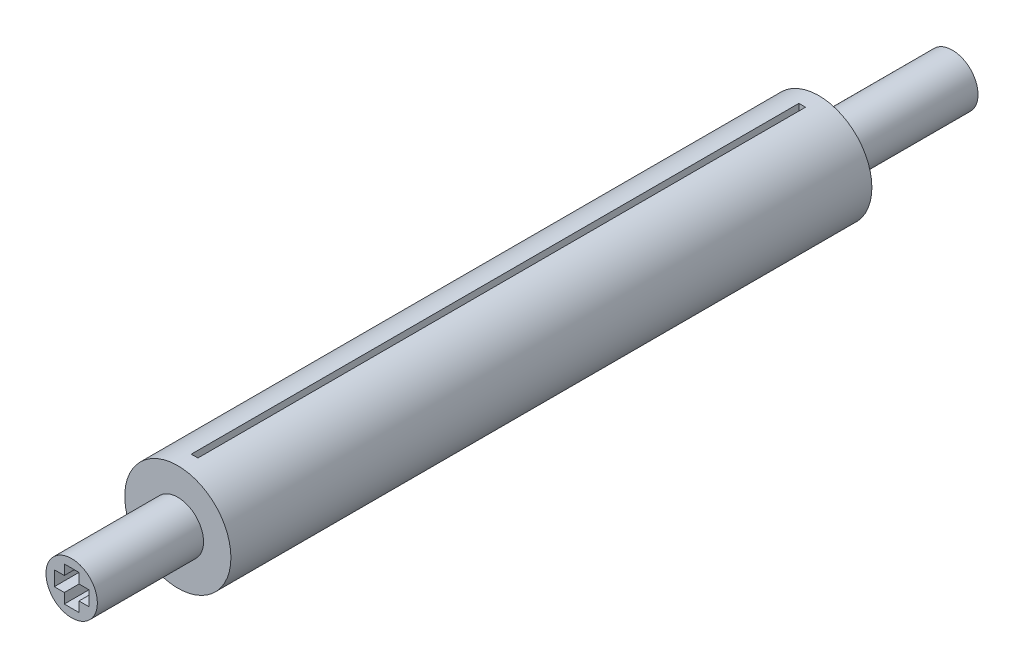
ISO-10303-21;
HEADER;
FILE_DESCRIPTION(('STEP AP214'),'2;1');
FILE_NAME('part.step','',(''),(''),'','','');
FILE_SCHEMA(('AUTOMOTIVE_DESIGN { 1 0 10303 214 1 1 1 1 }'));
ENDSEC;
DATA;
#1=APPLICATION_CONTEXT('core data for automotive mechanical design processes');
#2=APPLICATION_PROTOCOL_DEFINITION('international standard','automotive_design',2000,#1);
#3=PRODUCT_CONTEXT('',#1,'mechanical');
#4=PRODUCT('Part','Part','',(#3));
#5=PRODUCT_RELATED_PRODUCT_CATEGORY('part','',(#4));
#6=PRODUCT_DEFINITION_FORMATION('','',#4);
#7=PRODUCT_DEFINITION_CONTEXT('part definition',#1,'design');
#8=PRODUCT_DEFINITION('design','',#6,#7);
#9=PRODUCT_DEFINITION_SHAPE('','',#8);
#10=(LENGTH_UNIT() NAMED_UNIT(*) SI_UNIT(.MILLI.,.METRE.));
#11=(NAMED_UNIT(*) PLANE_ANGLE_UNIT() SI_UNIT($,.RADIAN.));
#12=(NAMED_UNIT(*) SI_UNIT($,.STERADIAN.) SOLID_ANGLE_UNIT());
#13=UNCERTAINTY_MEASURE_WITH_UNIT(LENGTH_MEASURE(1.E-05),#10,'distance_accuracy_value','');
#14=(GEOMETRIC_REPRESENTATION_CONTEXT(3) GLOBAL_UNCERTAINTY_ASSIGNED_CONTEXT((#13)) GLOBAL_UNIT_ASSIGNED_CONTEXT((#10,
#11,#12)) REPRESENTATION_CONTEXT('',''));
#15=CARTESIAN_POINT('',(0.,0.,0.));
#16=DIRECTION('',(0.,0.,1.));
#17=DIRECTION('',(1.,0.,0.));
#18=AXIS2_PLACEMENT_3D('',#15,#16,#17);
#19=CARTESIAN_POINT('',(0.,0.,48.));
#20=DIRECTION('',(0.,0.,-1.));
#21=DIRECTION('',(-1.,0.,0.));
#22=AXIS2_PLACEMENT_3D('',#19,#20,#21);
#23=CYLINDRICAL_SURFACE('',#22,7.95);
#24=DIRECTION('',(0.,0.,-1.));
#25=VECTOR('',#24,1.);
#26=CARTESIAN_POINT('',(0.5,7.93426115022691,48.));
#27=LINE('',#26,#25);
#28=CARTESIAN_POINT('',(0.5,7.93426115022691,-45.5));
#29=VERTEX_POINT('',#28);
#30=CARTESIAN_POINT('',(0.5,7.93426115022691,45.5));
#31=VERTEX_POINT('',#30);
#32=EDGE_CURVE('E11',#29,#31,#27,.F.);
#33=ORIENTED_EDGE('',*,*,#32,.T.);
#34=CARTESIAN_POINT('',(0.,0.,45.5));
#35=DIRECTION('',(0.,0.,1.));
#36=DIRECTION('',(1.,0.,0.));
#37=AXIS2_PLACEMENT_3D('',#34,#35,#36);
#38=CIRCLE('',#37,7.95);
#39=CARTESIAN_POINT('',(-0.5,7.93426115022691,45.5));
#40=VERTEX_POINT('',#39);
#41=EDGE_CURVE('E279',#31,#40,#38,.T.);
#42=ORIENTED_EDGE('',*,*,#41,.T.);
#43=DIRECTION('',(0.,0.,-1.));
#44=VECTOR('',#43,1.);
#45=CARTESIAN_POINT('',(-0.5,7.93426115022691,48.));
#46=LINE('',#45,#44);
#47=CARTESIAN_POINT('',(-0.5,7.93426115022691,-45.5));
#48=VERTEX_POINT('',#47);
#49=EDGE_CURVE('E43',#40,#48,#46,.T.);
#50=ORIENTED_EDGE('',*,*,#49,.T.);
#51=CARTESIAN_POINT('',(0.,0.,-45.5));
#52=DIRECTION('',(0.,0.,-1.));
#53=DIRECTION('',(-1.,0.,0.));
#54=AXIS2_PLACEMENT_3D('',#51,#52,#53);
#55=CIRCLE('',#54,7.95);
#56=EDGE_CURVE('E292',#48,#29,#55,.T.);
#57=ORIENTED_EDGE('',*,*,#56,.T.);
#58=EDGE_LOOP('',(#33,#42,#50,#57));
#59=FACE_BOUND('',#58,.T.);
#60=CARTESIAN_POINT('',(0.,0.,48.));
#61=DIRECTION('',(0.,0.,1.));
#62=DIRECTION('',(1.,0.,0.));
#63=AXIS2_PLACEMENT_3D('',#60,#61,#62);
#64=CIRCLE('',#63,7.95);
#65=CARTESIAN_POINT('',(7.95,0.,48.));
#66=VERTEX_POINT('',#65);
#67=EDGE_CURVE('E286',#66,#66,#64,.T.);
#68=ORIENTED_EDGE('',*,*,#67,.F.);
#69=EDGE_LOOP('',(#68));
#70=FACE_BOUND('',#69,.T.);
#71=CARTESIAN_POINT('',(0.,0.,-48.));
#72=DIRECTION('',(0.,0.,1.));
#73=DIRECTION('',(1.,0.,0.));
#74=AXIS2_PLACEMENT_3D('',#71,#72,#73);
#75=CIRCLE('',#74,7.95);
#76=CARTESIAN_POINT('',(7.95,0.,-48.));
#77=VERTEX_POINT('',#76);
#78=EDGE_CURVE('E283',#77,#77,#75,.T.);
#79=ORIENTED_EDGE('',*,*,#78,.T.);
#80=EDGE_LOOP('',(#79));
#81=FACE_BOUND('',#80,.T.);
#82=ADVANCED_FACE('F36',(#59,#70,#81),#23,.T.);
#83=CARTESIAN_POINT('',(0.,0.,48.));
#84=DIRECTION('',(0.,0.,1.));
#85=DIRECTION('',(1.,0.,0.));
#86=AXIS2_PLACEMENT_3D('',#83,#84,#85);
#87=PLANE('',#86);
#88=CARTESIAN_POINT('',(0.,0.,48.));
#89=DIRECTION('',(0.,0.,1.));
#90=DIRECTION('',(1.,0.,0.));
#91=AXIS2_PLACEMENT_3D('',#88,#89,#90);
#92=CIRCLE('',#91,3.85);
#93=CARTESIAN_POINT('',(3.85,0.,48.));
#94=VERTEX_POINT('',#93);
#95=EDGE_CURVE('E280',#94,#94,#92,.T.);
#96=ORIENTED_EDGE('',*,*,#95,.F.);
#97=EDGE_LOOP('',(#96));
#98=FACE_BOUND('',#97,.T.);
#99=ORIENTED_EDGE('',*,*,#67,.T.);
#100=EDGE_LOOP('',(#99));
#101=FACE_BOUND('',#100,.T.);
#102=ADVANCED_FACE('F311',(#98,#101),#87,.T.);
#103=CARTESIAN_POINT('',(0.,0.,-48.));
#104=DIRECTION('',(0.,0.,1.));
#105=DIRECTION('',(1.,0.,0.));
#106=AXIS2_PLACEMENT_3D('',#103,#104,#105);
#107=PLANE('',#106);
#108=CARTESIAN_POINT('',(0.,0.,-48.));
#109=DIRECTION('',(0.,0.,-1.));
#110=DIRECTION('',(-1.,0.,0.));
#111=AXIS2_PLACEMENT_3D('',#108,#109,#110);
#112=CIRCLE('',#111,3.85);
#113=CARTESIAN_POINT('',(-3.85,0.,-48.));
#114=VERTEX_POINT('',#113);
#115=EDGE_CURVE('E276',#114,#114,#112,.T.);
#116=ORIENTED_EDGE('',*,*,#115,.F.);
#117=EDGE_LOOP('',(#116));
#118=FACE_BOUND('',#117,.T.);
#119=ORIENTED_EDGE('',*,*,#78,.F.);
#120=EDGE_LOOP('',(#119));
#121=FACE_BOUND('',#120,.T.);
#122=ADVANCED_FACE('F315',(#118,#121),#107,.F.);
#123=CARTESIAN_POINT('',(0.,0.,63.9));
#124=DIRECTION('',(0.,0.,-1.));
#125=DIRECTION('',(-1.,0.,0.));
#126=AXIS2_PLACEMENT_3D('',#123,#124,#125);
#127=CYLINDRICAL_SURFACE('',#126,3.85);
#128=CARTESIAN_POINT('',(0.,0.,63.9));
#129=DIRECTION('',(0.,0.,1.));
#130=DIRECTION('',(1.,0.,0.));
#131=AXIS2_PLACEMENT_3D('',#128,#129,#130);
#132=CIRCLE('',#131,3.85);
#133=CARTESIAN_POINT('',(3.85,0.,63.9));
#134=VERTEX_POINT('',#133);
#135=EDGE_CURVE('E275',#134,#134,#132,.T.);
#136=ORIENTED_EDGE('',*,*,#135,.F.);
#137=EDGE_LOOP('',(#136));
#138=FACE_BOUND('',#137,.T.);
#139=ORIENTED_EDGE('',*,*,#95,.T.);
#140=EDGE_LOOP('',(#139));
#141=FACE_BOUND('',#140,.T.);
#142=ADVANCED_FACE('F321',(#138,#141),#127,.T.);
#143=CARTESIAN_POINT('',(0.,0.,63.9));
#144=DIRECTION('',(0.,0.,1.));
#145=DIRECTION('',(1.,0.,0.));
#146=AXIS2_PLACEMENT_3D('',#143,#144,#145);
#147=PLANE('',#146);
#148=DIRECTION('',(0.,-1.,0.));
#149=VECTOR('',#148,1.);
#150=CARTESIAN_POINT('',(-1.1,2.6,63.9));
#151=LINE('',#150,#149);
#152=CARTESIAN_POINT('',(-1.1,2.6,63.9));
#153=VERTEX_POINT('',#152);
#154=CARTESIAN_POINT('',(-1.1,1.1,63.9));
#155=VERTEX_POINT('',#154);
#156=EDGE_CURVE('E58',#153,#155,#151,.T.);
#157=ORIENTED_EDGE('',*,*,#156,.F.);
#158=DIRECTION('',(-1.,0.,0.));
#159=VECTOR('',#158,1.);
#160=CARTESIAN_POINT('',(-1.1,2.6,63.9));
#161=LINE('',#160,#159);
#162=CARTESIAN_POINT('',(1.1,2.6,63.9));
#163=VERTEX_POINT('',#162);
#164=EDGE_CURVE('E182',#163,#153,#161,.T.);
#165=ORIENTED_EDGE('',*,*,#164,.F.);
#166=DIRECTION('',(0.,1.,0.));
#167=VECTOR('',#166,1.);
#168=CARTESIAN_POINT('',(1.1,1.1,63.9));
#169=LINE('',#168,#167);
#170=CARTESIAN_POINT('',(1.1,1.1,63.9));
#171=VERTEX_POINT('',#170);
#172=EDGE_CURVE('E244',#171,#163,#169,.T.);
#173=ORIENTED_EDGE('',*,*,#172,.F.);
#174=DIRECTION('',(-1.,0.,0.));
#175=VECTOR('',#174,1.);
#176=CARTESIAN_POINT('',(2.6,1.1,63.9));
#177=LINE('',#176,#175);
#178=CARTESIAN_POINT('',(2.6,1.1,63.9));
#179=VERTEX_POINT('',#178);
#180=EDGE_CURVE('E241',#179,#171,#177,.T.);
#181=ORIENTED_EDGE('',*,*,#180,.F.);
#182=DIRECTION('',(0.,1.,0.));
#183=VECTOR('',#182,1.);
#184=CARTESIAN_POINT('',(2.6,-1.1,63.9));
#185=LINE('',#184,#183);
#186=CARTESIAN_POINT('',(2.6,-1.1,63.9));
#187=VERTEX_POINT('',#186);
#188=EDGE_CURVE('E238',#187,#179,#185,.T.);
#189=ORIENTED_EDGE('',*,*,#188,.F.);
#190=DIRECTION('',(1.,0.,0.));
#191=VECTOR('',#190,1.);
#192=CARTESIAN_POINT('',(1.1,-1.1,63.9));
#193=LINE('',#192,#191);
#194=CARTESIAN_POINT('',(1.1,-1.1,63.9));
#195=VERTEX_POINT('',#194);
#196=EDGE_CURVE('E235',#195,#187,#193,.T.);
#197=ORIENTED_EDGE('',*,*,#196,.F.);
#198=DIRECTION('',(0.,1.,0.));
#199=VECTOR('',#198,1.);
#200=CARTESIAN_POINT('',(1.1,-2.6,63.9));
#201=LINE('',#200,#199);
#202=CARTESIAN_POINT('',(1.1,-2.6,63.9));
#203=VERTEX_POINT('',#202);
#204=EDGE_CURVE('E232',#203,#195,#201,.T.);
#205=ORIENTED_EDGE('',*,*,#204,.F.);
#206=DIRECTION('',(1.,0.,0.));
#207=VECTOR('',#206,1.);
#208=CARTESIAN_POINT('',(-1.1,-2.6,63.9));
#209=LINE('',#208,#207);
#210=CARTESIAN_POINT('',(-1.1,-2.6,63.9));
#211=VERTEX_POINT('',#210);
#212=EDGE_CURVE('E229',#211,#203,#209,.T.);
#213=ORIENTED_EDGE('',*,*,#212,.F.);
#214=DIRECTION('',(0.,-1.,0.));
#215=VECTOR('',#214,1.);
#216=CARTESIAN_POINT('',(-1.1,-1.1,63.9));
#217=LINE('',#216,#215);
#218=CARTESIAN_POINT('',(-1.1,-1.1,63.9));
#219=VERTEX_POINT('',#218);
#220=EDGE_CURVE('E226',#219,#211,#217,.T.);
#221=ORIENTED_EDGE('',*,*,#220,.F.);
#222=DIRECTION('',(1.,0.,0.));
#223=VECTOR('',#222,1.);
#224=CARTESIAN_POINT('',(-2.6,-1.1,63.9));
#225=LINE('',#224,#223);
#226=CARTESIAN_POINT('',(-2.6,-1.1,63.9));
#227=VERTEX_POINT('',#226);
#228=EDGE_CURVE('E223',#227,#219,#225,.T.);
#229=ORIENTED_EDGE('',*,*,#228,.F.);
#230=DIRECTION('',(0.,-1.,0.));
#231=VECTOR('',#230,1.);
#232=CARTESIAN_POINT('',(-2.6,1.1,63.9));
#233=LINE('',#232,#231);
#234=CARTESIAN_POINT('',(-2.6,1.1,63.9));
#235=VERTEX_POINT('',#234);
#236=EDGE_CURVE('E220',#235,#227,#233,.T.);
#237=ORIENTED_EDGE('',*,*,#236,.F.);
#238=DIRECTION('',(-1.,0.,0.));
#239=VECTOR('',#238,1.);
#240=CARTESIAN_POINT('',(-1.1,1.1,63.9));
#241=LINE('',#240,#239);
#242=EDGE_CURVE('E217',#155,#235,#241,.T.);
#243=ORIENTED_EDGE('',*,*,#242,.F.);
#244=EDGE_LOOP('',(#157,#165,#173,#181,#189,#197,#205,#213,#221,#229,#237,#243));
#245=FACE_BOUND('',#244,.T.);
#246=ORIENTED_EDGE('',*,*,#135,.T.);
#247=EDGE_LOOP('',(#246));
#248=FACE_BOUND('',#247,.T.);
#249=ADVANCED_FACE('F328',(#245,#248),#147,.T.);
#250=CARTESIAN_POINT('',(0.,0.,-68.));
#251=DIRECTION('',(0.,0.,1.));
#252=DIRECTION('',(1.,0.,0.));
#253=AXIS2_PLACEMENT_3D('',#250,#251,#252);
#254=CYLINDRICAL_SURFACE('',#253,3.85);
#255=CARTESIAN_POINT('',(0.,0.,-68.));
#256=DIRECTION('',(0.,0.,-1.));
#257=DIRECTION('',(-1.,0.,0.));
#258=AXIS2_PLACEMENT_3D('',#255,#256,#257);
#259=CIRCLE('',#258,3.85);
#260=CARTESIAN_POINT('',(-3.85,0.,-68.));
#261=VERTEX_POINT('',#260);
#262=EDGE_CURVE('E251',#261,#261,#259,.T.);
#263=ORIENTED_EDGE('',*,*,#262,.F.);
#264=EDGE_LOOP('',(#263));
#265=FACE_BOUND('',#264,.T.);
#266=ORIENTED_EDGE('',*,*,#115,.T.);
#267=EDGE_LOOP('',(#266));
#268=FACE_BOUND('',#267,.T.);
#269=ADVANCED_FACE('F332',(#265,#268),#254,.T.);
#270=CARTESIAN_POINT('',(0.,0.,-68.));
#271=DIRECTION('',(0.,0.,-1.));
#272=DIRECTION('',(-1.,0.,0.));
#273=AXIS2_PLACEMENT_3D('',#270,#271,#272);
#274=PLANE('',#273);
#275=ORIENTED_EDGE('',*,*,#262,.T.);
#276=EDGE_LOOP('',(#275));
#277=FACE_BOUND('',#276,.T.);
#278=ADVANCED_FACE('F336',(#277),#274,.T.);
#279=CARTESIAN_POINT('',(-1.1,2.6,48.8));
#280=DIRECTION('',(-1.,0.,0.));
#281=DIRECTION('',(0.,-1.,0.));
#282=AXIS2_PLACEMENT_3D('',#279,#280,#281);
#283=PLANE('',#282);
#284=ORIENTED_EDGE('',*,*,#156,.T.);
#285=DIRECTION('',(0.,0.,1.));
#286=VECTOR('',#285,1.);
#287=CARTESIAN_POINT('',(-1.1,1.1,48.8));
#288=LINE('',#287,#286);
#289=CARTESIAN_POINT('',(-1.1,1.1,48.8));
#290=VERTEX_POINT('',#289);
#291=EDGE_CURVE('E215',#290,#155,#288,.T.);
#292=ORIENTED_EDGE('',*,*,#291,.F.);
#293=DIRECTION('',(0.,-1.,0.));
#294=VECTOR('',#293,1.);
#295=CARTESIAN_POINT('',(-1.1,2.6,48.8));
#296=LINE('',#295,#294);
#297=CARTESIAN_POINT('',(-1.1,2.6,48.8));
#298=VERTEX_POINT('',#297);
#299=EDGE_CURVE('E178',#298,#290,#296,.T.);
#300=ORIENTED_EDGE('',*,*,#299,.F.);
#301=DIRECTION('',(0.,0.,1.));
#302=VECTOR('',#301,1.);
#303=CARTESIAN_POINT('',(-1.1,2.6,48.8));
#304=LINE('',#303,#302);
#305=EDGE_CURVE('E249',#298,#153,#304,.T.);
#306=ORIENTED_EDGE('',*,*,#305,.T.);
#307=EDGE_LOOP('',(#284,#292,#300,#306));
#308=FACE_BOUND('',#307,.T.);
#309=ADVANCED_FACE('F340',(#308),#283,.F.);
#310=CARTESIAN_POINT('',(-1.1,2.6,48.8));
#311=DIRECTION('',(0.,1.,0.));
#312=DIRECTION('',(0.,0.,1.));
#313=AXIS2_PLACEMENT_3D('',#310,#311,#312);
#314=PLANE('',#313);
#315=ORIENTED_EDGE('',*,*,#164,.T.);
#316=ORIENTED_EDGE('',*,*,#305,.F.);
#317=DIRECTION('',(-1.,0.,0.));
#318=VECTOR('',#317,1.);
#319=CARTESIAN_POINT('',(-1.1,2.6,48.8));
#320=LINE('',#319,#318);
#321=CARTESIAN_POINT('',(1.1,2.6,48.8));
#322=VERTEX_POINT('',#321);
#323=EDGE_CURVE('E212',#322,#298,#320,.T.);
#324=ORIENTED_EDGE('',*,*,#323,.F.);
#325=DIRECTION('',(0.,0.,1.));
#326=VECTOR('',#325,1.);
#327=CARTESIAN_POINT('',(1.1,2.6,48.8));
#328=LINE('',#327,#326);
#329=EDGE_CURVE('E252',#322,#163,#328,.T.);
#330=ORIENTED_EDGE('',*,*,#329,.T.);
#331=EDGE_LOOP('',(#315,#316,#324,#330));
#332=FACE_BOUND('',#331,.T.);
#333=ADVANCED_FACE('F344',(#332),#314,.F.);
#334=CARTESIAN_POINT('',(1.1,1.1,48.8));
#335=DIRECTION('',(1.,0.,0.));
#336=DIRECTION('',(0.,0.,-1.));
#337=AXIS2_PLACEMENT_3D('',#334,#335,#336);
#338=PLANE('',#337);
#339=ORIENTED_EDGE('',*,*,#172,.T.);
#340=ORIENTED_EDGE('',*,*,#329,.F.);
#341=DIRECTION('',(0.,1.,0.));
#342=VECTOR('',#341,1.);
#343=CARTESIAN_POINT('',(1.1,1.1,48.8));
#344=LINE('',#343,#342);
#345=CARTESIAN_POINT('',(1.1,1.1,48.8));
#346=VERTEX_POINT('',#345);
#347=EDGE_CURVE('E209',#346,#322,#344,.T.);
#348=ORIENTED_EDGE('',*,*,#347,.F.);
#349=DIRECTION('',(0.,0.,1.));
#350=VECTOR('',#349,1.);
#351=CARTESIAN_POINT('',(1.1,1.1,48.8));
#352=LINE('',#351,#350);
#353=EDGE_CURVE('E254',#346,#171,#352,.T.);
#354=ORIENTED_EDGE('',*,*,#353,.T.);
#355=EDGE_LOOP('',(#339,#340,#348,#354));
#356=FACE_BOUND('',#355,.T.);
#357=ADVANCED_FACE('F380',(#356),#338,.F.);
#358=CARTESIAN_POINT('',(2.6,1.1,48.8));
#359=DIRECTION('',(0.,1.,0.));
#360=DIRECTION('',(-1.,0.,0.));
#361=AXIS2_PLACEMENT_3D('',#358,#359,#360);
#362=PLANE('',#361);
#363=ORIENTED_EDGE('',*,*,#180,.T.);
#364=ORIENTED_EDGE('',*,*,#353,.F.);
#365=DIRECTION('',(-1.,0.,0.));
#366=VECTOR('',#365,1.);
#367=CARTESIAN_POINT('',(2.6,1.1,48.8));
#368=LINE('',#367,#366);
#369=CARTESIAN_POINT('',(2.6,1.1,48.8));
#370=VERTEX_POINT('',#369);
#371=EDGE_CURVE('E206',#370,#346,#368,.T.);
#372=ORIENTED_EDGE('',*,*,#371,.F.);
#373=DIRECTION('',(0.,0.,1.));
#374=VECTOR('',#373,1.);
#375=CARTESIAN_POINT('',(2.6,1.1,48.8));
#376=LINE('',#375,#374);
#377=EDGE_CURVE('E256',#370,#179,#376,.T.);
#378=ORIENTED_EDGE('',*,*,#377,.T.);
#379=EDGE_LOOP('',(#363,#364,#372,#378));
#380=FACE_BOUND('',#379,.T.);
#381=ADVANCED_FACE('F376',(#380),#362,.F.);
#382=CARTESIAN_POINT('',(2.6,-1.1,48.8));
#383=DIRECTION('',(1.,0.,0.));
#384=DIRECTION('',(0.,0.,-1.));
#385=AXIS2_PLACEMENT_3D('',#382,#383,#384);
#386=PLANE('',#385);
#387=ORIENTED_EDGE('',*,*,#188,.T.);
#388=ORIENTED_EDGE('',*,*,#377,.F.);
#389=DIRECTION('',(0.,1.,0.));
#390=VECTOR('',#389,1.);
#391=CARTESIAN_POINT('',(2.6,-1.1,48.8));
#392=LINE('',#391,#390);
#393=CARTESIAN_POINT('',(2.6,-1.1,48.8));
#394=VERTEX_POINT('',#393);
#395=EDGE_CURVE('E203',#394,#370,#392,.T.);
#396=ORIENTED_EDGE('',*,*,#395,.F.);
#397=DIRECTION('',(0.,0.,1.));
#398=VECTOR('',#397,1.);
#399=CARTESIAN_POINT('',(2.6,-1.1,48.8));
#400=LINE('',#399,#398);
#401=EDGE_CURVE('E258',#394,#187,#400,.T.);
#402=ORIENTED_EDGE('',*,*,#401,.T.);
#403=EDGE_LOOP('',(#387,#388,#396,#402));
#404=FACE_BOUND('',#403,.T.);
#405=ADVANCED_FACE('F372',(#404),#386,.F.);
#406=CARTESIAN_POINT('',(1.1,-1.1,48.8));
#407=DIRECTION('',(0.,-1.,0.));
#408=DIRECTION('',(0.,0.,-1.));
#409=AXIS2_PLACEMENT_3D('',#406,#407,#408);
#410=PLANE('',#409);
#411=ORIENTED_EDGE('',*,*,#196,.T.);
#412=ORIENTED_EDGE('',*,*,#401,.F.);
#413=DIRECTION('',(1.,0.,0.));
#414=VECTOR('',#413,1.);
#415=CARTESIAN_POINT('',(1.1,-1.1,48.8));
#416=LINE('',#415,#414);
#417=CARTESIAN_POINT('',(1.1,-1.1,48.8));
#418=VERTEX_POINT('',#417);
#419=EDGE_CURVE('E200',#418,#394,#416,.T.);
#420=ORIENTED_EDGE('',*,*,#419,.F.);
#421=DIRECTION('',(0.,0.,1.));
#422=VECTOR('',#421,1.);
#423=CARTESIAN_POINT('',(1.1,-1.1,48.8));
#424=LINE('',#423,#422);
#425=EDGE_CURVE('E260',#418,#195,#424,.T.);
#426=ORIENTED_EDGE('',*,*,#425,.T.);
#427=EDGE_LOOP('',(#411,#412,#420,#426));
#428=FACE_BOUND('',#427,.T.);
#429=ADVANCED_FACE('F368',(#428),#410,.F.);
#430=CARTESIAN_POINT('',(1.1,-2.6,48.8));
#431=DIRECTION('',(1.,0.,0.));
#432=DIRECTION('',(0.,0.,-1.));
#433=AXIS2_PLACEMENT_3D('',#430,#431,#432);
#434=PLANE('',#433);
#435=ORIENTED_EDGE('',*,*,#204,.T.);
#436=ORIENTED_EDGE('',*,*,#425,.F.);
#437=DIRECTION('',(0.,1.,0.));
#438=VECTOR('',#437,1.);
#439=CARTESIAN_POINT('',(1.1,-2.6,48.8));
#440=LINE('',#439,#438);
#441=CARTESIAN_POINT('',(1.1,-2.6,48.8));
#442=VERTEX_POINT('',#441);
#443=EDGE_CURVE('E197',#442,#418,#440,.T.);
#444=ORIENTED_EDGE('',*,*,#443,.F.);
#445=DIRECTION('',(0.,0.,1.));
#446=VECTOR('',#445,1.);
#447=CARTESIAN_POINT('',(1.1,-2.6,48.8));
#448=LINE('',#447,#446);
#449=EDGE_CURVE('E262',#442,#203,#448,.T.);
#450=ORIENTED_EDGE('',*,*,#449,.T.);
#451=EDGE_LOOP('',(#435,#436,#444,#450));
#452=FACE_BOUND('',#451,.T.);
#453=ADVANCED_FACE('F364',(#452),#434,.F.);
#454=CARTESIAN_POINT('',(-1.1,-2.6,48.8));
#455=DIRECTION('',(0.,-1.,0.));
#456=DIRECTION('',(0.,0.,-1.));
#457=AXIS2_PLACEMENT_3D('',#454,#455,#456);
#458=PLANE('',#457);
#459=ORIENTED_EDGE('',*,*,#212,.T.);
#460=ORIENTED_EDGE('',*,*,#449,.F.);
#461=DIRECTION('',(1.,0.,0.));
#462=VECTOR('',#461,1.);
#463=CARTESIAN_POINT('',(-1.1,-2.6,48.8));
#464=LINE('',#463,#462);
#465=CARTESIAN_POINT('',(-1.1,-2.6,48.8));
#466=VERTEX_POINT('',#465);
#467=EDGE_CURVE('E194',#466,#442,#464,.T.);
#468=ORIENTED_EDGE('',*,*,#467,.F.);
#469=DIRECTION('',(0.,0.,1.));
#470=VECTOR('',#469,1.);
#471=CARTESIAN_POINT('',(-1.1,-2.6,48.8));
#472=LINE('',#471,#470);
#473=EDGE_CURVE('E264',#466,#211,#472,.T.);
#474=ORIENTED_EDGE('',*,*,#473,.T.);
#475=EDGE_LOOP('',(#459,#460,#468,#474));
#476=FACE_BOUND('',#475,.T.);
#477=ADVANCED_FACE('F360',(#476),#458,.F.);
#478=CARTESIAN_POINT('',(-1.1,-1.1,48.8));
#479=DIRECTION('',(-1.,0.,0.));
#480=DIRECTION('',(0.,0.,1.));
#481=AXIS2_PLACEMENT_3D('',#478,#479,#480);
#482=PLANE('',#481);
#483=ORIENTED_EDGE('',*,*,#220,.T.);
#484=ORIENTED_EDGE('',*,*,#473,.F.);
#485=DIRECTION('',(0.,-1.,0.));
#486=VECTOR('',#485,1.);
#487=CARTESIAN_POINT('',(-1.1,-1.1,48.8));
#488=LINE('',#487,#486);
#489=CARTESIAN_POINT('',(-1.1,-1.1,48.8));
#490=VERTEX_POINT('',#489);
#491=EDGE_CURVE('E191',#490,#466,#488,.T.);
#492=ORIENTED_EDGE('',*,*,#491,.F.);
#493=DIRECTION('',(0.,0.,1.));
#494=VECTOR('',#493,1.);
#495=CARTESIAN_POINT('',(-1.1,-1.1,48.8));
#496=LINE('',#495,#494);
#497=EDGE_CURVE('E266',#490,#219,#496,.T.);
#498=ORIENTED_EDGE('',*,*,#497,.T.);
#499=EDGE_LOOP('',(#483,#484,#492,#498));
#500=FACE_BOUND('',#499,.T.);
#501=ADVANCED_FACE('F356',(#500),#482,.F.);
#502=CARTESIAN_POINT('',(-2.6,-1.1,48.8));
#503=DIRECTION('',(0.,-1.,0.));
#504=DIRECTION('',(0.,0.,-1.));
#505=AXIS2_PLACEMENT_3D('',#502,#503,#504);
#506=PLANE('',#505);
#507=ORIENTED_EDGE('',*,*,#228,.T.);
#508=ORIENTED_EDGE('',*,*,#497,.F.);
#509=DIRECTION('',(1.,0.,0.));
#510=VECTOR('',#509,1.);
#511=CARTESIAN_POINT('',(-2.6,-1.1,48.8));
#512=LINE('',#511,#510);
#513=CARTESIAN_POINT('',(-2.6,-1.1,48.8));
#514=VERTEX_POINT('',#513);
#515=EDGE_CURVE('E188',#514,#490,#512,.T.);
#516=ORIENTED_EDGE('',*,*,#515,.F.);
#517=DIRECTION('',(0.,0.,1.));
#518=VECTOR('',#517,1.);
#519=CARTESIAN_POINT('',(-2.6,-1.1,48.8));
#520=LINE('',#519,#518);
#521=EDGE_CURVE('E268',#514,#227,#520,.T.);
#522=ORIENTED_EDGE('',*,*,#521,.T.);
#523=EDGE_LOOP('',(#507,#508,#516,#522));
#524=FACE_BOUND('',#523,.T.);
#525=ADVANCED_FACE('F352',(#524),#506,.F.);
#526=CARTESIAN_POINT('',(-2.6,1.1,48.8));
#527=DIRECTION('',(-1.,0.,0.));
#528=DIRECTION('',(0.,0.,1.));
#529=AXIS2_PLACEMENT_3D('',#526,#527,#528);
#530=PLANE('',#529);
#531=ORIENTED_EDGE('',*,*,#236,.T.);
#532=ORIENTED_EDGE('',*,*,#521,.F.);
#533=DIRECTION('',(0.,-1.,0.));
#534=VECTOR('',#533,1.);
#535=CARTESIAN_POINT('',(-2.6,1.1,48.8));
#536=LINE('',#535,#534);
#537=CARTESIAN_POINT('',(-2.6,1.1,48.8));
#538=VERTEX_POINT('',#537);
#539=EDGE_CURVE('E185',#538,#514,#536,.T.);
#540=ORIENTED_EDGE('',*,*,#539,.F.);
#541=DIRECTION('',(0.,0.,1.));
#542=VECTOR('',#541,1.);
#543=CARTESIAN_POINT('',(-2.6,1.1,48.8));
#544=LINE('',#543,#542);
#545=EDGE_CURVE('E270',#538,#235,#544,.T.);
#546=ORIENTED_EDGE('',*,*,#545,.T.);
#547=EDGE_LOOP('',(#531,#532,#540,#546));
#548=FACE_BOUND('',#547,.T.);
#549=ADVANCED_FACE('F348',(#548),#530,.F.);
#550=CARTESIAN_POINT('',(-1.1,1.1,48.8));
#551=DIRECTION('',(0.,1.,0.));
#552=DIRECTION('',(0.,0.,1.));
#553=AXIS2_PLACEMENT_3D('',#550,#551,#552);
#554=PLANE('',#553);
#555=ORIENTED_EDGE('',*,*,#242,.T.);
#556=ORIENTED_EDGE('',*,*,#545,.F.);
#557=DIRECTION('',(-1.,0.,0.));
#558=VECTOR('',#557,1.);
#559=CARTESIAN_POINT('',(-1.1,1.1,48.8));
#560=LINE('',#559,#558);
#561=EDGE_CURVE('E181',#290,#538,#560,.T.);
#562=ORIENTED_EDGE('',*,*,#561,.F.);
#563=ORIENTED_EDGE('',*,*,#291,.T.);
#564=EDGE_LOOP('',(#555,#556,#562,#563));
#565=FACE_BOUND('',#564,.T.);
#566=ADVANCED_FACE('F345',(#565),#554,.F.);
#567=CARTESIAN_POINT('',(0.,0.,48.8));
#568=DIRECTION('',(0.,0.,-1.));
#569=DIRECTION('',(-1.,0.,0.));
#570=AXIS2_PLACEMENT_3D('',#567,#568,#569);
#571=PLANE('',#570);
#572=ORIENTED_EDGE('',*,*,#299,.T.);
#573=ORIENTED_EDGE('',*,*,#561,.T.);
#574=ORIENTED_EDGE('',*,*,#539,.T.);
#575=ORIENTED_EDGE('',*,*,#515,.T.);
#576=ORIENTED_EDGE('',*,*,#491,.T.);
#577=ORIENTED_EDGE('',*,*,#467,.T.);
#578=ORIENTED_EDGE('',*,*,#443,.T.);
#579=ORIENTED_EDGE('',*,*,#419,.T.);
#580=ORIENTED_EDGE('',*,*,#395,.T.);
#581=ORIENTED_EDGE('',*,*,#371,.T.);
#582=ORIENTED_EDGE('',*,*,#347,.T.);
#583=ORIENTED_EDGE('',*,*,#323,.T.);
#584=EDGE_LOOP('',(#572,#573,#574,#575,#576,#577,#578,#579,#580,#581,#582,#583));
#585=FACE_BOUND('',#584,.T.);
#586=ADVANCED_FACE('F307',(#585),#571,.F.);
#587=CARTESIAN_POINT('',(-0.5,-2.05,-45.5));
#588=DIRECTION('',(-1.,0.,0.));
#589=DIRECTION('',(0.,0.,1.));
#590=AXIS2_PLACEMENT_3D('',#587,#588,#589);
#591=PLANE('',#590);
#592=DIRECTION('',(0.,1.,0.));
#593=VECTOR('',#592,1.);
#594=CARTESIAN_POINT('',(-0.5,-2.05,45.5));
#595=LINE('',#594,#593);
#596=CARTESIAN_POINT('',(-0.5,-2.05,45.5));
#597=VERTEX_POINT('',#596);
#598=EDGE_CURVE('E50',#597,#40,#595,.T.);
#599=ORIENTED_EDGE('',*,*,#598,.F.);
#600=DIRECTION('',(0.,0.,1.));
#601=VECTOR('',#600,1.);
#602=CARTESIAN_POINT('',(-0.5,-2.05,-45.5));
#603=LINE('',#602,#601);
#604=CARTESIAN_POINT('',(-0.5,-2.05,-45.5));
#605=VERTEX_POINT('',#604);
#606=EDGE_CURVE('E150',#605,#597,#603,.T.);
#607=ORIENTED_EDGE('',*,*,#606,.F.);
#608=DIRECTION('',(0.,1.,0.));
#609=VECTOR('',#608,1.);
#610=CARTESIAN_POINT('',(-0.5,-2.05,-45.5));
#611=LINE('',#610,#609);
#612=EDGE_CURVE('E172',#605,#48,#611,.T.);
#613=ORIENTED_EDGE('',*,*,#612,.T.);
#614=ORIENTED_EDGE('',*,*,#49,.F.);
#615=EDGE_LOOP('',(#599,#607,#613,#614));
#616=FACE_BOUND('',#615,.T.);
#617=ADVANCED_FACE('F147',(#616),#591,.F.);
#618=CARTESIAN_POINT('',(-0.5,-2.05,-45.5));
#619=DIRECTION('',(0.,0.,-1.));
#620=DIRECTION('',(-1.,0.,0.));
#621=AXIS2_PLACEMENT_3D('',#618,#619,#620);
#622=PLANE('',#621);
#623=ORIENTED_EDGE('',*,*,#612,.F.);
#624=DIRECTION('',(-1.,0.,0.));
#625=VECTOR('',#624,1.);
#626=CARTESIAN_POINT('',(-0.5,-2.05,-45.5));
#627=LINE('',#626,#625);
#628=CARTESIAN_POINT('',(0.5,-2.05,-45.5));
#629=VERTEX_POINT('',#628);
#630=EDGE_CURVE('E155',#629,#605,#627,.T.);
#631=ORIENTED_EDGE('',*,*,#630,.F.);
#632=DIRECTION('',(0.,1.,0.));
#633=VECTOR('',#632,1.);
#634=CARTESIAN_POINT('',(0.5,-2.05,-45.5));
#635=LINE('',#634,#633);
#636=EDGE_CURVE('E174',#629,#29,#635,.T.);
#637=ORIENTED_EDGE('',*,*,#636,.T.);
#638=ORIENTED_EDGE('',*,*,#56,.F.);
#639=EDGE_LOOP('',(#623,#631,#637,#638));
#640=FACE_BOUND('',#639,.T.);
#641=ADVANCED_FACE('F299',(#640),#622,.F.);
#642=CARTESIAN_POINT('',(0.5,-2.05,-45.5));
#643=DIRECTION('',(1.,0.,0.));
#644=DIRECTION('',(0.,0.,-1.));
#645=AXIS2_PLACEMENT_3D('',#642,#643,#644);
#646=PLANE('',#645);
#647=ORIENTED_EDGE('',*,*,#636,.F.);
#648=DIRECTION('',(0.,0.,-1.));
#649=VECTOR('',#648,1.);
#650=CARTESIAN_POINT('',(0.5,-2.05,-45.5));
#651=LINE('',#650,#649);
#652=CARTESIAN_POINT('',(0.5,-2.05,45.5));
#653=VERTEX_POINT('',#652);
#654=EDGE_CURVE('E164',#653,#629,#651,.T.);
#655=ORIENTED_EDGE('',*,*,#654,.F.);
#656=DIRECTION('',(0.,1.,0.));
#657=VECTOR('',#656,1.);
#658=CARTESIAN_POINT('',(0.5,-2.05,45.5));
#659=LINE('',#658,#657);
#660=EDGE_CURVE('E154',#653,#31,#659,.T.);
#661=ORIENTED_EDGE('',*,*,#660,.T.);
#662=ORIENTED_EDGE('',*,*,#32,.F.);
#663=EDGE_LOOP('',(#647,#655,#661,#662));
#664=FACE_BOUND('',#663,.T.);
#665=ADVANCED_FACE('F297',(#664),#646,.F.);
#666=CARTESIAN_POINT('',(-0.5,-2.05,45.5));
#667=DIRECTION('',(0.,0.,1.));
#668=DIRECTION('',(1.,0.,0.));
#669=AXIS2_PLACEMENT_3D('',#666,#667,#668);
#670=PLANE('',#669);
#671=ORIENTED_EDGE('',*,*,#660,.F.);
#672=DIRECTION('',(1.,0.,0.));
#673=VECTOR('',#672,1.);
#674=CARTESIAN_POINT('',(-0.5,-2.05,45.5));
#675=LINE('',#674,#673);
#676=EDGE_CURVE('E158',#597,#653,#675,.T.);
#677=ORIENTED_EDGE('',*,*,#676,.F.);
#678=ORIENTED_EDGE('',*,*,#598,.T.);
#679=ORIENTED_EDGE('',*,*,#41,.F.);
#680=EDGE_LOOP('',(#671,#677,#678,#679));
#681=FACE_BOUND('',#680,.T.);
#682=ADVANCED_FACE('F159',(#681),#670,.F.);
#683=CARTESIAN_POINT('',(0.,-2.05,0.));
#684=DIRECTION('',(0.,1.,0.));
#685=DIRECTION('',(0.,0.,1.));
#686=AXIS2_PLACEMENT_3D('',#683,#684,#685);
#687=PLANE('',#686);
#688=ORIENTED_EDGE('',*,*,#606,.T.);
#689=ORIENTED_EDGE('',*,*,#676,.T.);
#690=ORIENTED_EDGE('',*,*,#654,.T.);
#691=ORIENTED_EDGE('',*,*,#630,.T.);
#692=EDGE_LOOP('',(#688,#689,#690,#691));
#693=FACE_BOUND('',#692,.T.);
#694=ADVANCED_FACE('F166',(#693),#687,.T.);
#695=CLOSED_SHELL('',(#82,#102,#122,#142,#249,#269,#278,#309,#333,#357,#381,#405,#429,#453,#477,
#501,#525,#549,#566,#586,#617,#641,#665,#682,#694));
#696=MANIFOLD_SOLID_BREP('B2',#695);
#697=ADVANCED_BREP_SHAPE_REPRESENTATION('',(#18,#696),#14);
#698=SHAPE_DEFINITION_REPRESENTATION(#9,#697);
ENDSEC;
END-ISO-10303-21;
